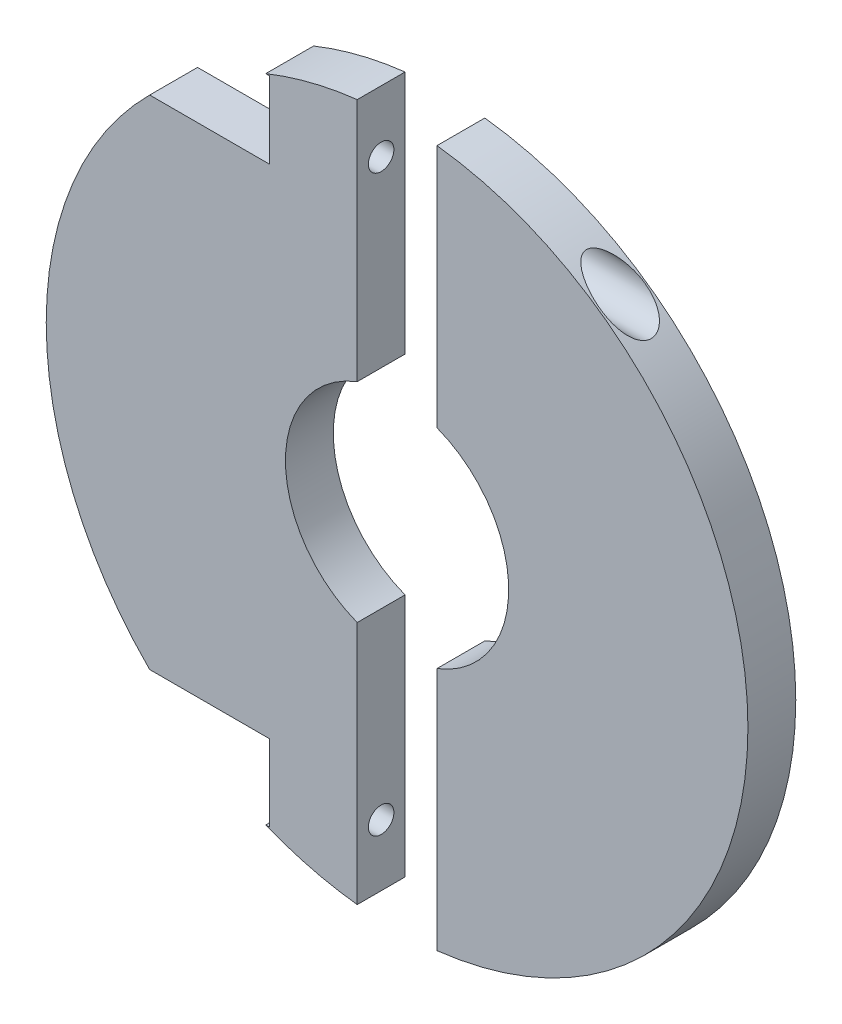
ISO-10303-21;
HEADER;
FILE_DESCRIPTION(('STEP AP214'),'2;1');
FILE_NAME('part.step','',(''),(''),'','','');
FILE_SCHEMA(('AUTOMOTIVE_DESIGN { 1 0 10303 214 1 1 1 1 }'));
ENDSEC;
DATA;
#1=APPLICATION_CONTEXT('core data for automotive mechanical design processes');
#2=APPLICATION_PROTOCOL_DEFINITION('international standard','automotive_design',2000,#1);
#3=PRODUCT_CONTEXT('',#1,'mechanical');
#4=PRODUCT('Part','Part','',(#3));
#5=PRODUCT_RELATED_PRODUCT_CATEGORY('part','',(#4));
#6=PRODUCT_DEFINITION_FORMATION('','',#4);
#7=PRODUCT_DEFINITION_CONTEXT('part definition',#1,'design');
#8=PRODUCT_DEFINITION('design','',#6,#7);
#9=PRODUCT_DEFINITION_SHAPE('','',#8);
#10=(LENGTH_UNIT() NAMED_UNIT(*) SI_UNIT(.MILLI.,.METRE.));
#11=(NAMED_UNIT(*) PLANE_ANGLE_UNIT() SI_UNIT($,.RADIAN.));
#12=(NAMED_UNIT(*) SI_UNIT($,.STERADIAN.) SOLID_ANGLE_UNIT());
#13=UNCERTAINTY_MEASURE_WITH_UNIT(LENGTH_MEASURE(1.E-05),#10,'distance_accuracy_value','');
#14=(GEOMETRIC_REPRESENTATION_CONTEXT(3) GLOBAL_UNCERTAINTY_ASSIGNED_CONTEXT((#13)) GLOBAL_UNIT_ASSIGNED_CONTEXT((#10,
#11,#12)) REPRESENTATION_CONTEXT('',''));
#15=CARTESIAN_POINT('',(0.,0.,0.));
#16=DIRECTION('',(0.,0.,1.));
#17=DIRECTION('',(1.,0.,0.));
#18=AXIS2_PLACEMENT_3D('',#15,#16,#17);
#19=CARTESIAN_POINT('',(0.,0.,7.5));
#20=DIRECTION('',(0.,0.,-1.));
#21=DIRECTION('',(-1.,0.,0.));
#22=AXIS2_PLACEMENT_3D('',#19,#20,#21);
#23=CYLINDRICAL_SURFACE('',#22,55.);
#24=CARTESIAN_POINT('',(0.,0.,0.));
#25=DIRECTION('',(0.,0.,1.));
#26=DIRECTION('',(1.,0.,0.));
#27=AXIS2_PLACEMENT_3D('',#24,#25,#26);
#28=CIRCLE('',#27,55.);
#29=CARTESIAN_POINT('',(-6.25,54.643732485986,0.));
#30=VERTEX_POINT('',#29);
#31=CARTESIAN_POINT('',(-20.591260281974,51.,0.));
#32=VERTEX_POINT('',#31);
#33=EDGE_CURVE('E210',#30,#32,#28,.T.);
#34=ORIENTED_EDGE('',*,*,#33,.T.);
#35=DIRECTION('',(0.,0.,-1.));
#36=VECTOR('',#35,1.);
#37=CARTESIAN_POINT('',(-20.591260281974,51.,7.5));
#38=LINE('',#37,#36);
#39=CARTESIAN_POINT('',(-20.591260281974,51.,7.5));
#40=VERTEX_POINT('',#39);
#41=EDGE_CURVE('E189',#32,#40,#38,.F.);
#42=ORIENTED_EDGE('',*,*,#41,.T.);
#43=CARTESIAN_POINT('',(0.,0.,7.5));
#44=DIRECTION('',(0.,0.,1.));
#45=DIRECTION('',(1.,0.,0.));
#46=AXIS2_PLACEMENT_3D('',#43,#44,#45);
#47=CIRCLE('',#46,55.);
#48=CARTESIAN_POINT('',(-6.25,54.643732485986,7.5));
#49=VERTEX_POINT('',#48);
#50=EDGE_CURVE('E220',#49,#40,#47,.T.);
#51=ORIENTED_EDGE('',*,*,#50,.F.);
#52=DIRECTION('',(0.,0.,-1.));
#53=VECTOR('',#52,1.);
#54=CARTESIAN_POINT('',(-6.25,54.643732485986,7.5));
#55=LINE('',#54,#53);
#56=EDGE_CURVE('E201',#49,#30,#55,.T.);
#57=ORIENTED_EDGE('',*,*,#56,.T.);
#58=EDGE_LOOP('',(#34,#42,#51,#57));
#59=FACE_BOUND('',#58,.T.);
#60=ADVANCED_FACE('F49',(#59),#23,.T.);
#61=CARTESIAN_POINT('',(-38.7814388593306,39.,7.5));
#62=VERTEX_POINT('',#61);
#63=CARTESIAN_POINT('',(-38.7814388593306,-39.,7.5));
#64=VERTEX_POINT('',#63);
#65=EDGE_CURVE('E222',#62,#64,#47,.T.);
#66=ORIENTED_EDGE('',*,*,#65,.F.);
#67=DIRECTION('',(0.,0.,-1.));
#68=VECTOR('',#67,1.);
#69=CARTESIAN_POINT('',(-38.7814388593306,39.,7.49999999999996));
#70=LINE('',#69,#68);
#71=CARTESIAN_POINT('',(-38.7814388593306,39.,0.));
#72=VERTEX_POINT('',#71);
#73=EDGE_CURVE('E145',#62,#72,#70,.T.);
#74=ORIENTED_EDGE('',*,*,#73,.T.);
#75=CARTESIAN_POINT('',(-38.7814388593306,-39.,0.));
#76=VERTEX_POINT('',#75);
#77=EDGE_CURVE('E225',#72,#76,#28,.T.);
#78=ORIENTED_EDGE('',*,*,#77,.T.);
#79=DIRECTION('',(0.,0.,-1.));
#80=VECTOR('',#79,1.);
#81=CARTESIAN_POINT('',(-38.7814388593306,-39.,7.49999999999996));
#82=LINE('',#81,#80);
#83=EDGE_CURVE('E184',#76,#64,#82,.F.);
#84=ORIENTED_EDGE('',*,*,#83,.T.);
#85=EDGE_LOOP('',(#66,#74,#78,#84));
#86=FACE_BOUND('',#85,.T.);
#87=ADVANCED_FACE('F247',(#86),#23,.T.);
#88=CARTESIAN_POINT('',(-20.591260281974,-51.,7.5));
#89=VERTEX_POINT('',#88);
#90=CARTESIAN_POINT('',(-6.25,-54.643732485986,7.5));
#91=VERTEX_POINT('',#90);
#92=EDGE_CURVE('E209',#89,#91,#47,.T.);
#93=ORIENTED_EDGE('',*,*,#92,.F.);
#94=DIRECTION('',(0.,0.,-1.));
#95=VECTOR('',#94,1.);
#96=CARTESIAN_POINT('',(-20.591260281974,-51.,7.5));
#97=LINE('',#96,#95);
#98=CARTESIAN_POINT('',(-20.591260281974,-51.,0.));
#99=VERTEX_POINT('',#98);
#100=EDGE_CURVE('E181',#89,#99,#97,.T.);
#101=ORIENTED_EDGE('',*,*,#100,.T.);
#102=CARTESIAN_POINT('',(-6.25,-54.643732485986,0.));
#103=VERTEX_POINT('',#102);
#104=EDGE_CURVE('E204',#99,#103,#28,.T.);
#105=ORIENTED_EDGE('',*,*,#104,.T.);
#106=DIRECTION('',(0.,0.,-1.));
#107=VECTOR('',#106,1.);
#108=CARTESIAN_POINT('',(-6.25,-54.643732485986,7.5));
#109=LINE('',#108,#107);
#110=EDGE_CURVE('E206',#103,#91,#109,.F.);
#111=ORIENTED_EDGE('',*,*,#110,.T.);
#112=EDGE_LOOP('',(#93,#101,#105,#111));
#113=FACE_BOUND('',#112,.T.);
#114=ADVANCED_FACE('F51',(#113),#23,.T.);
#115=CARTESIAN_POINT('',(0.,0.,7.5));
#116=DIRECTION('',(0.,0.,1.));
#117=DIRECTION('',(1.,0.,0.));
#118=AXIS2_PLACEMENT_3D('',#115,#116,#117);
#119=PLANE('',#118);
#120=DIRECTION('',(1.,0.,0.));
#121=VECTOR('',#120,1.);
#122=CARTESIAN_POINT('',(-40.,51.,7.5));
#123=LINE('',#122,#121);
#124=CARTESIAN_POINT('',(-20.,51.,7.5));
#125=VERTEX_POINT('',#124);
#126=EDGE_CURVE('E150',#40,#125,#123,.T.);
#127=ORIENTED_EDGE('',*,*,#126,.T.);
#128=DIRECTION('',(0.,-1.,0.));
#129=VECTOR('',#128,1.);
#130=CARTESIAN_POINT('',(-20.,39.,7.5));
#131=LINE('',#130,#129);
#132=CARTESIAN_POINT('',(-20.,39.,7.5));
#133=VERTEX_POINT('',#132);
#134=EDGE_CURVE('E154',#125,#133,#131,.T.);
#135=ORIENTED_EDGE('',*,*,#134,.T.);
#136=DIRECTION('',(1.,0.,0.));
#137=VECTOR('',#136,1.);
#138=CARTESIAN_POINT('',(-40.,39.,7.5));
#139=LINE('',#138,#137);
#140=EDGE_CURVE('E139',#62,#133,#139,.T.);
#141=ORIENTED_EDGE('',*,*,#140,.F.);
#142=ORIENTED_EDGE('',*,*,#65,.T.);
#143=DIRECTION('',(1.,0.,0.));
#144=VECTOR('',#143,1.);
#145=CARTESIAN_POINT('',(-40.,-39.,7.5));
#146=LINE('',#145,#144);
#147=CARTESIAN_POINT('',(-20.,-39.,7.5));
#148=VERTEX_POINT('',#147);
#149=EDGE_CURVE('E163',#64,#148,#146,.T.);
#150=ORIENTED_EDGE('',*,*,#149,.T.);
#151=DIRECTION('',(0.,-1.,0.));
#152=VECTOR('',#151,1.);
#153=CARTESIAN_POINT('',(-20.,-39.,7.5));
#154=LINE('',#153,#152);
#155=CARTESIAN_POINT('',(-20.,-51.,7.5));
#156=VERTEX_POINT('',#155);
#157=EDGE_CURVE('E171',#148,#156,#154,.T.);
#158=ORIENTED_EDGE('',*,*,#157,.T.);
#159=DIRECTION('',(1.,0.,0.));
#160=VECTOR('',#159,1.);
#161=CARTESIAN_POINT('',(-40.,-51.,7.5));
#162=LINE('',#161,#160);
#163=EDGE_CURVE('E161',#89,#156,#162,.T.);
#164=ORIENTED_EDGE('',*,*,#163,.F.);
#165=ORIENTED_EDGE('',*,*,#92,.T.);
#166=DIRECTION('',(0.,-1.,0.));
#167=VECTOR('',#166,1.);
#168=CARTESIAN_POINT('',(-6.25,-61.0752829571837,7.5));
#169=LINE('',#168,#167);
#170=CARTESIAN_POINT('',(-6.25,-16.3458710382775,7.5));
#171=VERTEX_POINT('',#170);
#172=EDGE_CURVE('E211',#171,#91,#169,.T.);
#173=ORIENTED_EDGE('',*,*,#172,.F.);
#174=CARTESIAN_POINT('',(0.,0.,7.5));
#175=DIRECTION('',(0.,0.,1.));
#176=DIRECTION('',(1.,0.,0.));
#177=AXIS2_PLACEMENT_3D('',#174,#175,#176);
#178=CIRCLE('',#177,17.5);
#179=CARTESIAN_POINT('',(-6.25,16.3458710382775,7.5));
#180=VERTEX_POINT('',#179);
#181=EDGE_CURVE('E197',#180,#171,#178,.T.);
#182=ORIENTED_EDGE('',*,*,#181,.F.);
#183=EDGE_CURVE('E200',#49,#180,#169,.T.);
#184=ORIENTED_EDGE('',*,*,#183,.F.);
#185=ORIENTED_EDGE('',*,*,#50,.T.);
#186=EDGE_LOOP('',(#127,#135,#141,#142,#150,#158,#164,#165,#173,#182,#184,#185));
#187=FACE_BOUND('',#186,.T.);
#188=ADVANCED_FACE('F159',(#187),#119,.T.);
#189=CARTESIAN_POINT('',(0.,0.,0.));
#190=DIRECTION('',(0.,0.,1.));
#191=DIRECTION('',(1.,0.,0.));
#192=AXIS2_PLACEMENT_3D('',#189,#190,#191);
#193=PLANE('',#192);
#194=DIRECTION('',(0.,1.,0.));
#195=VECTOR('',#194,1.);
#196=CARTESIAN_POINT('',(-20.,39.,0.));
#197=LINE('',#196,#195);
#198=CARTESIAN_POINT('',(-20.,39.,0.));
#199=VERTEX_POINT('',#198);
#200=CARTESIAN_POINT('',(-20.,51.,0.));
#201=VERTEX_POINT('',#200);
#202=EDGE_CURVE('E156',#199,#201,#197,.T.);
#203=ORIENTED_EDGE('',*,*,#202,.T.);
#204=DIRECTION('',(-1.,0.,0.));
#205=VECTOR('',#204,1.);
#206=CARTESIAN_POINT('',(0.,51.,0.));
#207=LINE('',#206,#205);
#208=EDGE_CURVE('E12',#201,#32,#207,.T.);
#209=ORIENTED_EDGE('',*,*,#208,.T.);
#210=ORIENTED_EDGE('',*,*,#33,.F.);
#211=DIRECTION('',(0.,-1.,0.));
#212=VECTOR('',#211,1.);
#213=CARTESIAN_POINT('',(-6.25,-61.0752829571837,0.));
#214=LINE('',#213,#212);
#215=CARTESIAN_POINT('',(-6.25,16.3458710382775,0.));
#216=VERTEX_POINT('',#215);
#217=EDGE_CURVE('E219',#30,#216,#214,.T.);
#218=ORIENTED_EDGE('',*,*,#217,.T.);
#219=CARTESIAN_POINT('',(0.,0.,0.));
#220=DIRECTION('',(0.,0.,1.));
#221=DIRECTION('',(1.,0.,0.));
#222=AXIS2_PLACEMENT_3D('',#219,#220,#221);
#223=CIRCLE('',#222,17.5);
#224=CARTESIAN_POINT('',(-6.25,-16.3458710382775,0.));
#225=VERTEX_POINT('',#224);
#226=EDGE_CURVE('E218',#216,#225,#223,.T.);
#227=ORIENTED_EDGE('',*,*,#226,.T.);
#228=EDGE_CURVE('E215',#225,#103,#214,.T.);
#229=ORIENTED_EDGE('',*,*,#228,.T.);
#230=ORIENTED_EDGE('',*,*,#104,.F.);
#231=DIRECTION('',(1.,0.,0.));
#232=VECTOR('',#231,1.);
#233=CARTESIAN_POINT('',(0.,-51.,0.));
#234=LINE('',#233,#232);
#235=CARTESIAN_POINT('',(-20.,-51.,0.));
#236=VERTEX_POINT('',#235);
#237=EDGE_CURVE('E214',#99,#236,#234,.T.);
#238=ORIENTED_EDGE('',*,*,#237,.T.);
#239=DIRECTION('',(0.,1.,0.));
#240=VECTOR('',#239,1.);
#241=CARTESIAN_POINT('',(-20.,-39.,0.));
#242=LINE('',#241,#240);
#243=CARTESIAN_POINT('',(-20.,-39.,0.));
#244=VERTEX_POINT('',#243);
#245=EDGE_CURVE('E176',#236,#244,#242,.T.);
#246=ORIENTED_EDGE('',*,*,#245,.T.);
#247=DIRECTION('',(-1.,0.,0.));
#248=VECTOR('',#247,1.);
#249=CARTESIAN_POINT('',(0.,-39.,0.));
#250=LINE('',#249,#248);
#251=EDGE_CURVE('E240',#244,#76,#250,.T.);
#252=ORIENTED_EDGE('',*,*,#251,.T.);
#253=ORIENTED_EDGE('',*,*,#77,.F.);
#254=DIRECTION('',(1.,0.,0.));
#255=VECTOR('',#254,1.);
#256=CARTESIAN_POINT('',(0.,39.,0.));
#257=LINE('',#256,#255);
#258=EDGE_CURVE('E57',#72,#199,#257,.T.);
#259=ORIENTED_EDGE('',*,*,#258,.T.);
#260=EDGE_LOOP('',(#203,#209,#210,#218,#227,#229,#230,#238,#246,#252,#253,#259));
#261=FACE_BOUND('',#260,.T.);
#262=ADVANCED_FACE('F244',(#261),#193,.F.);
#263=CARTESIAN_POINT('',(0.,0.,0.));
#264=DIRECTION('',(0.,0.,1.));
#265=DIRECTION('',(1.,0.,0.));
#266=AXIS2_PLACEMENT_3D('',#263,#264,#265);
#267=CYLINDRICAL_SURFACE('',#266,17.5);
#268=ORIENTED_EDGE('',*,*,#181,.T.);
#269=DIRECTION('',(0.,0.,1.));
#270=VECTOR('',#269,1.);
#271=CARTESIAN_POINT('',(-6.25,-16.3458710382775,0.));
#272=LINE('',#271,#270);
#273=EDGE_CURVE('E193',#171,#225,#272,.F.);
#274=ORIENTED_EDGE('',*,*,#273,.T.);
#275=ORIENTED_EDGE('',*,*,#226,.F.);
#276=DIRECTION('',(0.,0.,1.));
#277=VECTOR('',#276,1.);
#278=CARTESIAN_POINT('',(-6.25,16.3458710382775,0.));
#279=LINE('',#278,#277);
#280=EDGE_CURVE('E196',#216,#180,#279,.T.);
#281=ORIENTED_EDGE('',*,*,#280,.T.);
#282=EDGE_LOOP('',(#268,#274,#275,#281));
#283=FACE_BOUND('',#282,.T.);
#284=ADVANCED_FACE('F260',(#283),#267,.F.);
#285=CARTESIAN_POINT('',(-6.25,-61.0752829571837,0.));
#286=DIRECTION('',(-1.,0.,0.));
#287=DIRECTION('',(0.,0.,1.));
#288=AXIS2_PLACEMENT_3D('',#285,#286,#287);
#289=PLANE('',#288);
#290=CARTESIAN_POINT('',(-6.25,45.,3.75));
#291=DIRECTION('',(-1.,0.,0.));
#292=DIRECTION('',(0.,0.,1.));
#293=AXIS2_PLACEMENT_3D('',#290,#291,#292);
#294=CIRCLE('',#293,2.);
#295=CARTESIAN_POINT('',(-6.25,45.,5.75000000000001));
#296=VERTEX_POINT('',#295);
#297=EDGE_CURVE('E205',#296,#296,#294,.T.);
#298=ORIENTED_EDGE('',*,*,#297,.T.);
#299=EDGE_LOOP('',(#298));
#300=FACE_BOUND('',#299,.T.);
#301=ORIENTED_EDGE('',*,*,#183,.T.);
#302=ORIENTED_EDGE('',*,*,#280,.F.);
#303=ORIENTED_EDGE('',*,*,#217,.F.);
#304=ORIENTED_EDGE('',*,*,#56,.F.);
#305=EDGE_LOOP('',(#301,#302,#303,#304));
#306=FACE_BOUND('',#305,.T.);
#307=ADVANCED_FACE('F268',(#300,#306),#289,.F.);
#308=CARTESIAN_POINT('',(-6.25,-45.,3.75));
#309=DIRECTION('',(-1.,0.,0.));
#310=DIRECTION('',(0.,0.,1.));
#311=AXIS2_PLACEMENT_3D('',#308,#309,#310);
#312=CIRCLE('',#311,2.);
#313=CARTESIAN_POINT('',(-6.25,-45.,5.75000000000001));
#314=VERTEX_POINT('',#313);
#315=EDGE_CURVE('E192',#314,#314,#312,.T.);
#316=ORIENTED_EDGE('',*,*,#315,.T.);
#317=EDGE_LOOP('',(#316));
#318=FACE_BOUND('',#317,.T.);
#319=ORIENTED_EDGE('',*,*,#228,.F.);
#320=ORIENTED_EDGE('',*,*,#273,.F.);
#321=ORIENTED_EDGE('',*,*,#172,.T.);
#322=ORIENTED_EDGE('',*,*,#110,.F.);
#323=EDGE_LOOP('',(#319,#320,#321,#322));
#324=FACE_BOUND('',#323,.T.);
#325=ADVANCED_FACE('F255',(#318,#324),#289,.F.);
#326=CARTESIAN_POINT('',(-55.,-45.,3.75));
#327=DIRECTION('',(1.,0.,0.));
#328=DIRECTION('',(0.,0.,-1.));
#329=AXIS2_PLACEMENT_3D('',#326,#327,#328);
#330=CYLINDRICAL_SURFACE('',#329,2.);
#331=CARTESIAN_POINT('',(-20.,-45.,3.75));
#332=DIRECTION('',(1.,0.,0.));
#333=DIRECTION('',(0.,0.,-1.));
#334=AXIS2_PLACEMENT_3D('',#331,#332,#333);
#335=CIRCLE('',#334,2.);
#336=CARTESIAN_POINT('',(-20.,-45.,1.75));
#337=VERTEX_POINT('',#336);
#338=EDGE_CURVE('E185',#337,#337,#335,.F.);
#339=ORIENTED_EDGE('',*,*,#338,.T.);
#340=EDGE_LOOP('',(#339));
#341=FACE_BOUND('',#340,.T.);
#342=ORIENTED_EDGE('',*,*,#315,.F.);
#343=EDGE_LOOP('',(#342));
#344=FACE_BOUND('',#343,.T.);
#345=ADVANCED_FACE('F276',(#341,#344),#330,.F.);
#346=CARTESIAN_POINT('',(-55.,45.,3.75));
#347=DIRECTION('',(1.,0.,0.));
#348=DIRECTION('',(0.,0.,-1.));
#349=AXIS2_PLACEMENT_3D('',#346,#347,#348);
#350=CYLINDRICAL_SURFACE('',#349,2.);
#351=CARTESIAN_POINT('',(-20.,45.,3.75));
#352=DIRECTION('',(1.,0.,0.));
#353=DIRECTION('',(0.,0.,-1.));
#354=AXIS2_PLACEMENT_3D('',#351,#352,#353);
#355=CIRCLE('',#354,2.);
#356=CARTESIAN_POINT('',(-20.,45.,1.75));
#357=VERTEX_POINT('',#356);
#358=EDGE_CURVE('E168',#357,#357,#355,.F.);
#359=ORIENTED_EDGE('',*,*,#358,.T.);
#360=EDGE_LOOP('',(#359));
#361=FACE_BOUND('',#360,.T.);
#362=ORIENTED_EDGE('',*,*,#297,.F.);
#363=EDGE_LOOP('',(#362));
#364=FACE_BOUND('',#363,.T.);
#365=ADVANCED_FACE('F337',(#361,#364),#350,.F.);
#366=CARTESIAN_POINT('',(-40.,51.,0.));
#367=DIRECTION('',(0.,1.,0.));
#368=DIRECTION('',(0.,0.,1.));
#369=AXIS2_PLACEMENT_3D('',#366,#367,#368);
#370=PLANE('',#369);
#371=ORIENTED_EDGE('',*,*,#208,.F.);
#372=DIRECTION('',(0.,0.,1.));
#373=VECTOR('',#372,1.);
#374=CARTESIAN_POINT('',(-20.,51.,0.));
#375=LINE('',#374,#373);
#376=EDGE_CURVE('E64',#201,#125,#375,.T.);
#377=ORIENTED_EDGE('',*,*,#376,.T.);
#378=ORIENTED_EDGE('',*,*,#126,.F.);
#379=ORIENTED_EDGE('',*,*,#41,.F.);
#380=EDGE_LOOP('',(#371,#377,#378,#379));
#381=FACE_BOUND('',#380,.T.);
#382=ADVANCED_FACE('F267',(#381),#370,.F.);
#383=CARTESIAN_POINT('',(-40.,39.,0.));
#384=DIRECTION('',(0.,-1.,0.));
#385=DIRECTION('',(0.,0.,-1.));
#386=AXIS2_PLACEMENT_3D('',#383,#384,#385);
#387=PLANE('',#386);
#388=ORIENTED_EDGE('',*,*,#140,.T.);
#389=DIRECTION('',(0.,0.,-1.));
#390=VECTOR('',#389,1.);
#391=CARTESIAN_POINT('',(-20.,39.,0.));
#392=LINE('',#391,#390);
#393=EDGE_CURVE('E142',#133,#199,#392,.T.);
#394=ORIENTED_EDGE('',*,*,#393,.T.);
#395=ORIENTED_EDGE('',*,*,#258,.F.);
#396=ORIENTED_EDGE('',*,*,#73,.F.);
#397=EDGE_LOOP('',(#388,#394,#395,#396));
#398=FACE_BOUND('',#397,.T.);
#399=ADVANCED_FACE('F141',(#398),#387,.F.);
#400=CARTESIAN_POINT('',(-20.,0.,0.));
#401=DIRECTION('',(1.,0.,0.));
#402=DIRECTION('',(0.,0.,-1.));
#403=AXIS2_PLACEMENT_3D('',#400,#401,#402);
#404=PLANE('',#403);
#405=ORIENTED_EDGE('',*,*,#134,.F.);
#406=ORIENTED_EDGE('',*,*,#376,.F.);
#407=ORIENTED_EDGE('',*,*,#202,.F.);
#408=ORIENTED_EDGE('',*,*,#393,.F.);
#409=EDGE_LOOP('',(#405,#406,#407,#408));
#410=FACE_BOUND('',#409,.T.);
#411=ORIENTED_EDGE('',*,*,#358,.F.);
#412=EDGE_LOOP('',(#411));
#413=FACE_BOUND('',#412,.T.);
#414=ADVANCED_FACE('F152',(#410,#413),#404,.F.);
#415=CARTESIAN_POINT('',(-40.,-39.,0.));
#416=DIRECTION('',(0.,1.,0.));
#417=DIRECTION('',(0.,0.,1.));
#418=AXIS2_PLACEMENT_3D('',#415,#416,#417);
#419=PLANE('',#418);
#420=ORIENTED_EDGE('',*,*,#251,.F.);
#421=DIRECTION('',(0.,0.,1.));
#422=VECTOR('',#421,1.);
#423=CARTESIAN_POINT('',(-20.,-39.,0.));
#424=LINE('',#423,#422);
#425=EDGE_CURVE('E72',#244,#148,#424,.T.);
#426=ORIENTED_EDGE('',*,*,#425,.T.);
#427=ORIENTED_EDGE('',*,*,#149,.F.);
#428=ORIENTED_EDGE('',*,*,#83,.F.);
#429=EDGE_LOOP('',(#420,#426,#427,#428));
#430=FACE_BOUND('',#429,.T.);
#431=ADVANCED_FACE('F366',(#430),#419,.F.);
#432=CARTESIAN_POINT('',(-40.,-51.,0.));
#433=DIRECTION('',(0.,-1.,0.));
#434=DIRECTION('',(0.,0.,-1.));
#435=AXIS2_PLACEMENT_3D('',#432,#433,#434);
#436=PLANE('',#435);
#437=ORIENTED_EDGE('',*,*,#163,.T.);
#438=DIRECTION('',(0.,0.,-1.));
#439=VECTOR('',#438,1.);
#440=CARTESIAN_POINT('',(-20.,-51.,0.));
#441=LINE('',#440,#439);
#442=EDGE_CURVE('E174',#156,#236,#441,.T.);
#443=ORIENTED_EDGE('',*,*,#442,.T.);
#444=ORIENTED_EDGE('',*,*,#237,.F.);
#445=ORIENTED_EDGE('',*,*,#100,.F.);
#446=EDGE_LOOP('',(#437,#443,#444,#445));
#447=FACE_BOUND('',#446,.T.);
#448=ADVANCED_FACE('F373',(#447),#436,.F.);
#449=CARTESIAN_POINT('',(-20.,0.,0.));
#450=DIRECTION('',(1.,0.,0.));
#451=DIRECTION('',(0.,0.,-1.));
#452=AXIS2_PLACEMENT_3D('',#449,#450,#451);
#453=PLANE('',#452);
#454=ORIENTED_EDGE('',*,*,#425,.F.);
#455=ORIENTED_EDGE('',*,*,#245,.F.);
#456=ORIENTED_EDGE('',*,*,#442,.F.);
#457=ORIENTED_EDGE('',*,*,#157,.F.);
#458=EDGE_LOOP('',(#454,#455,#456,#457));
#459=FACE_BOUND('',#458,.T.);
#460=ORIENTED_EDGE('',*,*,#338,.F.);
#461=EDGE_LOOP('',(#460));
#462=FACE_BOUND('',#461,.T.);
#463=ADVANCED_FACE('F381',(#459,#462),#453,.F.);
#464=CLOSED_SHELL('',(#60,#87,#114,#188,#262,#284,#307,#325,#345,#365,#382,#399,#414,#431,#448,#463));
#465=MANIFOLD_SOLID_BREP('B2',#464);
#466=CARTESIAN_POINT('',(-55.,45.,3.75));
#467=DIRECTION('',(1.,0.,0.));
#468=DIRECTION('',(0.,0.,-1.));
#469=AXIS2_PLACEMENT_3D('',#466,#467,#468);
#470=CYLINDRICAL_SURFACE('',#469,2.);
#471=CARTESIAN_POINT('',(6.25,45.,3.75));
#472=DIRECTION('',(1.,0.,0.));
#473=DIRECTION('',(0.,0.,-1.));
#474=AXIS2_PLACEMENT_3D('',#471,#472,#473);
#475=CIRCLE('',#474,2.);
#476=CARTESIAN_POINT('',(6.25,45.,1.75));
#477=VERTEX_POINT('',#476);
#478=EDGE_CURVE('E494',#477,#477,#475,.T.);
#479=ORIENTED_EDGE('',*,*,#478,.F.);
#480=EDGE_LOOP('',(#479));
#481=FACE_BOUND('',#480,.T.);
#482=CARTESIAN_POINT('',(20.,45.,3.75));
#483=DIRECTION('',(1.,0.,0.));
#484=DIRECTION('',(0.,0.,-1.));
#485=AXIS2_PLACEMENT_3D('',#482,#483,#484);
#486=CIRCLE('',#485,2.);
#487=CARTESIAN_POINT('',(20.,45.,1.75));
#488=VERTEX_POINT('',#487);
#489=EDGE_CURVE('E506',#488,#488,#486,.F.);
#490=ORIENTED_EDGE('',*,*,#489,.F.);
#491=EDGE_LOOP('',(#490));
#492=FACE_BOUND('',#491,.T.);
#493=ADVANCED_FACE('F414',(#481,#492),#470,.F.);
#494=CARTESIAN_POINT('',(0.,0.,0.));
#495=DIRECTION('',(0.,0.,1.));
#496=DIRECTION('',(1.,0.,0.));
#497=AXIS2_PLACEMENT_3D('',#494,#495,#496);
#498=CYLINDRICAL_SURFACE('',#497,17.5);
#499=CARTESIAN_POINT('',(0.,0.,7.5));
#500=DIRECTION('',(0.,0.,1.));
#501=DIRECTION('',(1.,0.,0.));
#502=AXIS2_PLACEMENT_3D('',#499,#500,#501);
#503=CIRCLE('',#502,17.5);
#504=CARTESIAN_POINT('',(6.25,-16.3458710382775,7.5));
#505=VERTEX_POINT('',#504);
#506=CARTESIAN_POINT('',(6.25,16.3458710382775,7.5));
#507=VERTEX_POINT('',#506);
#508=EDGE_CURVE('E469',#505,#507,#503,.T.);
#509=ORIENTED_EDGE('',*,*,#508,.T.);
#510=DIRECTION('',(0.,0.,1.));
#511=VECTOR('',#510,1.);
#512=CARTESIAN_POINT('',(6.25,16.3458710382775,0.));
#513=LINE('',#512,#511);
#514=CARTESIAN_POINT('',(6.25,16.3458710382775,0.));
#515=VERTEX_POINT('',#514);
#516=EDGE_CURVE('E47',#507,#515,#513,.F.);
#517=ORIENTED_EDGE('',*,*,#516,.T.);
#518=CARTESIAN_POINT('',(0.,0.,0.));
#519=DIRECTION('',(0.,0.,1.));
#520=DIRECTION('',(1.,0.,0.));
#521=AXIS2_PLACEMENT_3D('',#518,#519,#520);
#522=CIRCLE('',#521,17.5);
#523=CARTESIAN_POINT('',(6.25,-16.3458710382775,0.));
#524=VERTEX_POINT('',#523);
#525=EDGE_CURVE('E489',#524,#515,#522,.T.);
#526=ORIENTED_EDGE('',*,*,#525,.F.);
#527=DIRECTION('',(0.,0.,1.));
#528=VECTOR('',#527,1.);
#529=CARTESIAN_POINT('',(6.25,-16.3458710382775,0.));
#530=LINE('',#529,#528);
#531=EDGE_CURVE('E429',#524,#505,#530,.T.);
#532=ORIENTED_EDGE('',*,*,#531,.T.);
#533=EDGE_LOOP('',(#509,#517,#526,#532));
#534=FACE_BOUND('',#533,.T.);
#535=ADVANCED_FACE('F527',(#534),#498,.F.);
#536=CARTESIAN_POINT('',(0.,0.,0.));
#537=DIRECTION('',(0.,0.,1.));
#538=DIRECTION('',(1.,0.,0.));
#539=AXIS2_PLACEMENT_3D('',#536,#537,#538);
#540=PLANE('',#539);
#541=CARTESIAN_POINT('',(0.,0.,0.));
#542=DIRECTION('',(0.,0.,1.));
#543=DIRECTION('',(1.,0.,0.));
#544=AXIS2_PLACEMENT_3D('',#541,#542,#543);
#545=CIRCLE('',#544,55.);
#546=CARTESIAN_POINT('',(6.25,-54.643732485986,0.));
#547=VERTEX_POINT('',#546);
#548=CARTESIAN_POINT('',(6.25,54.643732485986,0.));
#549=VERTEX_POINT('',#548);
#550=EDGE_CURVE('E484',#547,#549,#545,.T.);
#551=ORIENTED_EDGE('',*,*,#550,.F.);
#552=DIRECTION('',(0.,1.,0.));
#553=VECTOR('',#552,1.);
#554=CARTESIAN_POINT('',(6.25,-61.0752829571837,0.));
#555=LINE('',#554,#553);
#556=EDGE_CURVE('E463',#547,#524,#555,.T.);
#557=ORIENTED_EDGE('',*,*,#556,.T.);
#558=ORIENTED_EDGE('',*,*,#525,.T.);
#559=EDGE_CURVE('E445',#515,#549,#555,.T.);
#560=ORIENTED_EDGE('',*,*,#559,.T.);
#561=EDGE_LOOP('',(#551,#557,#558,#560));
#562=FACE_BOUND('',#561,.T.);
#563=ADVANCED_FACE('F538',(#562),#540,.F.);
#564=CARTESIAN_POINT('',(0.,0.,7.5));
#565=DIRECTION('',(0.,0.,1.));
#566=DIRECTION('',(1.,0.,0.));
#567=AXIS2_PLACEMENT_3D('',#564,#565,#566);
#568=PLANE('',#567);
#569=DIRECTION('',(0.,1.,0.));
#570=VECTOR('',#569,1.);
#571=CARTESIAN_POINT('',(6.25,-61.0752829571837,7.5));
#572=LINE('',#571,#570);
#573=CARTESIAN_POINT('',(6.25,-54.643732485986,7.5));
#574=VERTEX_POINT('',#573);
#575=EDGE_CURVE('E437',#574,#505,#572,.T.);
#576=ORIENTED_EDGE('',*,*,#575,.F.);
#577=CARTESIAN_POINT('',(0.,0.,7.5));
#578=DIRECTION('',(0.,0.,1.));
#579=DIRECTION('',(1.,0.,0.));
#580=AXIS2_PLACEMENT_3D('',#577,#578,#579);
#581=CIRCLE('',#580,55.);
#582=CARTESIAN_POINT('',(6.25,54.643732485986,7.5));
#583=VERTEX_POINT('',#582);
#584=EDGE_CURVE('E477',#574,#583,#581,.T.);
#585=ORIENTED_EDGE('',*,*,#584,.T.);
#586=EDGE_CURVE('E480',#507,#583,#572,.T.);
#587=ORIENTED_EDGE('',*,*,#586,.F.);
#588=ORIENTED_EDGE('',*,*,#508,.F.);
#589=EDGE_LOOP('',(#576,#585,#587,#588));
#590=FACE_BOUND('',#589,.T.);
#591=ADVANCED_FACE('F475',(#590),#568,.T.);
#592=CARTESIAN_POINT('',(0.,0.,7.5));
#593=DIRECTION('',(0.,0.,-1.));
#594=DIRECTION('',(-1.,0.,0.));
#595=AXIS2_PLACEMENT_3D('',#592,#593,#594);
#596=CYLINDRICAL_SURFACE('',#595,55.);
#597=CARTESIAN_POINT('',(31.6227766016838,45.,0.250000000000001));
#598=CARTESIAN_POINT('',(31.8420950543226,44.8458787635018,0.250000458388072));
#599=CARTESIAN_POINT('',(32.0602923742594,44.6901454623172,0.260154015410824));
#600=CARTESIAN_POINT('',(32.49313519459,44.3764306989816,0.302359411949685));
#601=CARTESIAN_POINT('',(32.7077791959112,44.2184483377699,0.334420264122423));
#602=CARTESIAN_POINT('',(33.1306135743933,43.9025255510696,0.422489837433311));
#603=CARTESIAN_POINT('',(33.3388295652085,43.7445884258366,0.478385169017945));
#604=CARTESIAN_POINT('',(33.7471850259007,43.4303314002269,0.617013201334181));
#605=CARTESIAN_POINT('',(33.947334463536,43.2740096932389,0.699711562534951));
#606=CARTESIAN_POINT('',(34.312092274444,42.985201925741,0.883616021373642));
#607=CARTESIAN_POINT('',(34.4780338800831,42.8521599899524,0.981265691483649));
#608=CARTESIAN_POINT('',(34.7974800886019,42.5931626701778,1.20319911924517));
#609=CARTESIAN_POINT('',(34.950989528796,42.4672045357942,1.32747244843959));
#610=CARTESIAN_POINT('',(35.2180307423911,42.2458958671199,1.58455735170681));
#611=CARTESIAN_POINT('',(35.3340923011092,42.1488032727651,1.71319894691111));
#612=CARTESIAN_POINT('',(35.5482834516401,41.968310371704,1.99316842235639));
#613=CARTESIAN_POINT('',(35.6464440688622,41.884886400912,2.14445620775796));
#614=CARTESIAN_POINT('',(35.79617414905,41.7569279115682,2.42713568390587));
#615=CARTESIAN_POINT('',(35.8532296428878,41.7079134834359,2.55358276542928));
#616=CARTESIAN_POINT('',(35.9508780740192,41.6237738565797,2.81719051708628));
#617=CARTESIAN_POINT('',(35.9914831294569,41.5886384344246,2.9543432118212));
#618=CARTESIAN_POINT('',(36.0380297059552,41.5482951177347,3.16605757901066));
#619=CARTESIAN_POINT('',(36.0511767659733,41.5368853619645,3.23794779026547));
#620=CARTESIAN_POINT('',(36.0723199098445,41.5185252218983,3.38303124682096));
#621=CARTESIAN_POINT('',(36.0803184211647,41.5115727360693,3.45622386130426));
#622=CARTESIAN_POINT('',(36.090983451059,41.5023007193234,3.60328107292141));
#623=CARTESIAN_POINT('',(36.093650692213,41.4999805605585,3.67714557762638));
#624=CARTESIAN_POINT('',(36.0936054742506,41.5000197235499,3.82484833082712));
#625=CARTESIAN_POINT('',(36.0908934914742,41.5023786309664,3.89868658106867));
#626=CARTESIAN_POINT('',(36.0759487048528,41.5153722306184,4.1027135981675));
#627=CARTESIAN_POINT('',(36.0579670234048,41.5310030779537,4.23223446405736));
#628=CARTESIAN_POINT('',(36.006368167402,41.5757451049547,4.48558301240364));
#629=CARTESIAN_POINT('',(35.9727483423371,41.6048585697865,4.60940972584677));
#630=CARTESIAN_POINT('',(35.8902801639032,41.6760224068813,4.85361411064645));
#631=CARTESIAN_POINT('',(35.8408950494652,41.718527946866,4.97367514788929));
#632=CARTESIAN_POINT('',(35.7298394524554,41.8136811875366,5.20357742760476));
#633=CARTESIAN_POINT('',(35.6681628606923,41.866333931222,5.31341354803375));
#634=CARTESIAN_POINT('',(35.494938914923,42.0134345110411,5.58479255165745));
#635=CARTESIAN_POINT('',(35.3756092819021,42.1140605942878,5.73802948557669));
#636=CARTESIAN_POINT('',(35.1188488477503,42.328413158819,6.01801360071261));
#637=CARTESIAN_POINT('',(34.9813694214777,42.4421747249411,6.14468716888734));
#638=CARTESIAN_POINT('',(34.7284623367669,42.6491955934893,6.34599842538182));
#639=CARTESIAN_POINT('',(34.6157057348918,42.7407880977771,6.42581931282805));
#640=CARTESIAN_POINT('',(34.3844337180939,42.9270632553372,6.5725884667519));
#641=CARTESIAN_POINT('',(34.265915364424,43.0217474772643,6.6395300760835));
#642=CARTESIAN_POINT('',(34.0243103134206,43.2130777206263,6.76161038302518));
#643=CARTESIAN_POINT('',(33.9012194157791,43.3097255069179,6.81673789713291));
#644=CARTESIAN_POINT('',(33.6514801057161,43.5040567363227,6.91607979672159));
#645=CARTESIAN_POINT('',(33.5248305826258,43.6017404967124,6.96029073196981));
#646=CARTESIAN_POINT('',(33.1991439076037,43.8506398383589,7.0599033233812));
#647=CARTESIAN_POINT('',(32.9981554040149,44.0021110395841,7.10833884520236));
#648=CARTESIAN_POINT('',(32.5914893897334,44.3041656112893,7.18366389445192));
#649=CARTESIAN_POINT('',(32.3858093650551,44.4547484486263,7.21054157708577));
#650=CARTESIAN_POINT('',(31.9708632750705,44.7541002549348,7.24460613648321));
#651=CARTESIAN_POINT('',(31.7615902936654,44.9028644839525,7.25174939850707));
#652=CARTESIAN_POINT('',(31.3411712803159,45.1973102202744,7.24753378121093));
#653=CARTESIAN_POINT('',(31.1300256377677,45.3429923480787,7.23617866266074));
#654=CARTESIAN_POINT('',(30.6977862786064,45.6367954839781,7.19491469410993));
#655=CARTESIAN_POINT('',(30.4766551202353,45.784752099517,7.164229206721));
#656=CARTESIAN_POINT('',(30.0346132575873,46.0759380748463,7.08394329260879));
#657=CARTESIAN_POINT('',(29.8137026387433,46.2191660114071,7.03433722658881));
#658=CARTESIAN_POINT('',(29.3743130986205,46.4996497376504,6.91609230585669));
#659=CARTESIAN_POINT('',(29.1558283649269,46.6369247182068,6.84752084093213));
#660=CARTESIAN_POINT('',(28.7223792093079,46.9051144307061,6.69019053331859));
#661=CARTESIAN_POINT('',(28.5074124010178,47.03603360362,6.60144603979304));
#662=CARTESIAN_POINT('',(28.1190812654533,47.2690135090598,6.41827410862014));
#663=CARTESIAN_POINT('',(27.9447870085281,47.3722313158242,6.32729692016065));
#664=CARTESIAN_POINT('',(27.602386829666,47.572549890184,6.12741185435794));
#665=CARTESIAN_POINT('',(27.4342908727988,47.6696409720063,6.01847652262712));
#666=CARTESIAN_POINT('',(27.1893925242828,47.8094755457665,5.83869681068185));
#667=CARTESIAN_POINT('',(27.1085888676154,47.8553306083915,5.77569053146518));
#668=CARTESIAN_POINT('',(26.9504887759667,47.9445447793906,5.64367746535775));
#669=CARTESIAN_POINT('',(26.8731934361805,47.9879031094765,5.57466882404402));
#670=CARTESIAN_POINT('',(26.7234743194077,48.0714389950869,5.4302382114388));
#671=CARTESIAN_POINT('',(26.6510364186184,48.1116258384102,5.35483641880215));
#672=CARTESIAN_POINT('',(26.5123724890051,48.1881766190425,5.19680068394398));
#673=CARTESIAN_POINT('',(26.4461406096783,48.2245441608486,5.11417369804295));
#674=CARTESIAN_POINT('',(26.320893992748,48.2930193215028,4.93952334645453));
#675=CARTESIAN_POINT('',(26.262019130058,48.3250451477917,4.84736548875346));
#676=CARTESIAN_POINT('',(26.1558776141691,48.3825765836612,4.65458624115878));
#677=CARTESIAN_POINT('',(26.1086069975447,48.4080844195809,4.55396775679646));
#678=CARTESIAN_POINT('',(26.0289326095628,48.4509727958841,4.34364992361395));
#679=CARTESIAN_POINT('',(25.9967256290411,48.4682458101415,4.23385133139605));
#680=CARTESIAN_POINT('',(25.9520145298561,48.4922017740142,4.00922988902914));
#681=CARTESIAN_POINT('',(25.939473247438,48.4989046988614,3.89441693816));
#682=CARTESIAN_POINT('',(25.9360712931067,48.5007235742445,3.67914917355556));
#683=CARTESIAN_POINT('',(25.9426394006944,48.4972136804968,3.57873889959587));
#684=CARTESIAN_POINT('',(25.9712640499477,48.4818904028324,3.38079257528502));
#685=CARTESIAN_POINT('',(25.9933336134412,48.4700700377875,3.28325901331193));
#686=CARTESIAN_POINT('',(26.0572635931149,48.4357366824542,3.07205382449279));
#687=CARTESIAN_POINT('',(26.1024664411487,48.4114125722642,2.95970787721405));
#688=CARTESIAN_POINT('',(26.2079888895033,48.3543678617263,2.74468209616582));
#689=CARTESIAN_POINT('',(26.2683379616683,48.3216308884435,2.64202165083824));
#690=CARTESIAN_POINT('',(26.3867489058574,48.2570522776688,2.46604136725706));
#691=CARTESIAN_POINT('',(26.4428615904977,48.2263369567011,2.39095589794038));
#692=CARTESIAN_POINT('',(26.5604916348344,48.1616526834651,2.24659962879725));
#693=CARTESIAN_POINT('',(26.622012398959,48.1276816804883,2.17733254611662));
#694=CARTESIAN_POINT('',(26.7493153352047,48.0570435928858,2.04407426242137));
#695=CARTESIAN_POINT('',(26.8151051472988,48.0203716578518,1.98009301350092));
#696=CARTESIAN_POINT('',(26.9499593302606,47.9448191236834,1.85705305311104));
#697=CARTESIAN_POINT('',(27.0190249564956,47.9059376766638,1.79799625310939));
#698=CARTESIAN_POINT('',(27.2218766519451,47.7911344946375,1.63418359106525));
#699=CARTESIAN_POINT('',(27.3589429790794,47.7128316668171,1.53514000504755));
#700=CARTESIAN_POINT('',(27.6390921553925,47.5510971388355,1.35063703762005));
#701=CARTESIAN_POINT('',(27.7821800392873,47.467661118687,1.26518932119923));
#702=CARTESIAN_POINT('',(28.0726118055665,47.2964788711152,1.10616854220793));
#703=CARTESIAN_POINT('',(28.2199613270271,47.2087268140293,1.03261214955294));
#704=CARTESIAN_POINT('',(28.5174667504237,47.0296106881911,0.896347084075411));
#705=CARTESIAN_POINT('',(28.6676234049546,46.9382456432534,0.83364136791726));
#706=CARTESIAN_POINT('',(29.0487515322497,46.703777961797,0.688152001758612));
#707=CARTESIAN_POINT('',(29.2809741610324,46.5585746735852,0.611985263555554));
#708=CARTESIAN_POINT('',(29.7475654207427,46.2618514994648,0.481362240494975));
#709=CARTESIAN_POINT('',(29.9819350626157,46.1103285044547,0.426916784380482));
#710=CARTESIAN_POINT('',(30.4514829099748,45.8015966866746,0.339247598277051));
#711=CARTESIAN_POINT('',(30.6866618125454,45.6443786891727,0.306059882084532));
#712=CARTESIAN_POINT('',(31.1559068850984,45.3253783561697,0.261439034097344));
#713=CARTESIAN_POINT('',(31.3899733617123,45.1635973752938,0.249999513427956));
#714=CARTESIAN_POINT('',(31.6227766016838,45.,0.250000000000001));
#715=B_SPLINE_CURVE_WITH_KNOTS('',3,(#597,#598,#599,#600,#601,#602,#603,#604,#605,#606,#607,
#608,#609,#610,#611,#612,#613,#614,#615,#616,#617,#618,#619,#620,#621,#622,#623,#624,#625,#626,
#627,#628,#629,#630,#631,#632,#633,#634,#635,#636,#637,#638,#639,#640,#641,#642,#643,#644,#645,
#646,#647,#648,#649,#650,#651,#652,#653,#654,#655,#656,#657,#658,#659,#660,#661,#662,#663,#664,
#665,#666,#667,#668,#669,#670,#671,#672,#673,#674,#675,#676,#677,#678,#679,#680,#681,#682,#683,
#684,#685,#686,#687,#688,#689,#690,#691,#692,#693,#694,#695,#696,#697,#698,#699,#700,#701,#702,
#703,#704,#705,#706,#707,#708,#709,#710,#711,#712,#713,#714),.UNSPECIFIED.,.T.,.F.,(4,2,2,2,2,2,
2,2,2,2,2,2,2,2,2,2,2,2,2,2,2,2,2,2,2,2,2,2,2,2,2,2,2,2,2,2,2,2,2,2,2,2,2,2,2,2,2,2,2,2,2,2,2,2,
2,2,2,2,4),(0.,0.803954098267608,1.6082391423747,2.40873985625903,3.20821901135434,
3.90876985641657,4.60904679658689,5.2028672092012,5.79564843928358,6.23541589522823,
6.67485880675994,6.89648856500003,7.11801375129009,7.33950891086768,7.56098445752609,
7.95406714888388,8.3472164881433,8.75551127547896,9.1640095045921,9.81652665891707,
10.4708288612495,10.9674355011167,11.464298145475,11.9616290742705,12.4591169860757,
13.226837354088,13.9949792519475,14.7648174554633,15.534499168362,16.337269424674,
17.1402791346419,17.9404713765297,18.7400962094146,19.4055916508741,20.0721141002677,
20.4086960667384,20.7453823917134,21.0810430035399,21.4163839309787,21.7573562294259,
22.0982119063848,22.4434040365479,22.7879430415118,23.088351602685,23.3890128210548,
23.7575293236733,24.1267685296184,24.4222839565761,24.7179867635321,25.0142341962195,
25.3105960897748,25.8687396329004,26.4273594996282,26.9867558042993,27.5463042977809,
28.3980762315215,29.2502722713531,30.1039082668061,30.9572934544782),.UNSPECIFIED.);
#716=CARTESIAN_POINT('',(31.6227766016838,45.,0.250000000000001));
#717=VERTEX_POINT('',#716);
#718=EDGE_CURVE('E419',#717,#717,#715,.T.);
#719=ORIENTED_EDGE('',*,*,#718,.T.);
#720=EDGE_LOOP('',(#719));
#721=FACE_BOUND('',#720,.T.);
#722=CARTESIAN_POINT('',(31.6227766016838,-45.,0.250000000000001));
#723=CARTESIAN_POINT('',(31.3799427304015,-45.1706451879615,0.249995829388893));
#724=CARTESIAN_POINT('',(31.1356700367032,-45.3393596700522,0.262445829503002));
#725=CARTESIAN_POINT('',(30.6458841348383,-45.6718460372572,0.310977595876841));
#726=CARTESIAN_POINT('',(30.4003700556027,-45.8356136427537,0.34707924375167));
#727=CARTESIAN_POINT('',(29.9097639521131,-46.1572542112932,0.442594554332486));
#728=CARTESIAN_POINT('',(29.6646723293258,-46.3151230826205,0.502024081538982));
#729=CARTESIAN_POINT('',(29.1771652862108,-46.6237716077248,0.644795773499654));
#730=CARTESIAN_POINT('',(28.9347478462927,-46.774556938199,0.728118396465471));
#731=CARTESIAN_POINT('',(28.5837753014971,-46.989199449617,0.869082703758903));
#732=CARTESIAN_POINT('',(28.4730900103971,-47.0563452366757,0.916564013197468));
#733=CARTESIAN_POINT('',(28.2532674071781,-47.188656615638,1.01747162547053));
#734=CARTESIAN_POINT('',(28.1441298069306,-47.2538225787697,1.07089680492817));
#735=CARTESIAN_POINT('',(27.9278408458573,-47.3819745972449,1.18416424903119));
#736=CARTESIAN_POINT('',(27.8206903152044,-47.4449597505957,1.24400912792769));
#737=CARTESIAN_POINT('',(27.6090919502502,-47.5684037200711,1.37068773793034));
#738=CARTESIAN_POINT('',(27.5046437619492,-47.6288628677404,1.43752054779408));
#739=CARTESIAN_POINT('',(27.3146059190213,-47.7380610179107,1.56844833875898));
#740=CARTESIAN_POINT('',(27.2285182432802,-47.7872076356907,1.63147726482155));
#741=CARTESIAN_POINT('',(27.0597311571462,-47.8829861397783,1.76378126319735));
#742=CARTESIAN_POINT('',(26.977032693017,-47.929617324914,1.83305806286127));
#743=CARTESIAN_POINT('',(26.8163615492758,-48.0196960440719,1.97835542199066));
#744=CARTESIAN_POINT('',(26.7383766683225,-48.0631518645654,2.05435719407731));
#745=CARTESIAN_POINT('',(26.5884886337923,-48.1462314464009,2.21399324095065));
#746=CARTESIAN_POINT('',(26.5165799660447,-48.185858686971,2.29762044915461));
#747=CARTESIAN_POINT('',(26.3795322968828,-48.2610246724389,2.47516505273276));
#748=CARTESIAN_POINT('',(26.3145629825262,-48.2964625446098,2.56925873861004));
#749=CARTESIAN_POINT('',(26.1964145367442,-48.3606491439015,2.76674864868159));
#750=CARTESIAN_POINT('',(26.1432230924201,-48.3894048582988,2.8701349975306));
#751=CARTESIAN_POINT('',(26.0593486723802,-48.4346187625791,3.07006910477631));
#752=CARTESIAN_POINT('',(26.0265192848989,-48.4522560824651,3.16543137651728));
#753=CARTESIAN_POINT('',(25.9753302161196,-48.479718252633,3.36105339923454));
#754=CARTESIAN_POINT('',(25.9569543505193,-48.489551841238,3.46130753851939));
#755=CARTESIAN_POINT('',(25.9365994645138,-48.5004428624613,3.66456121040753));
#756=CARTESIAN_POINT('',(25.9347122034301,-48.5014511823881,3.76757291061674));
#757=CARTESIAN_POINT('',(25.9478180812614,-48.4944407473794,3.97221056492122));
#758=CARTESIAN_POINT('',(25.9628179856639,-48.4864183744871,4.07383594710333));
#759=CARTESIAN_POINT('',(26.0060986944922,-48.4632165306524,4.26439811499661));
#760=CARTESIAN_POINT('',(26.0331938358595,-48.4486756072667,4.35369309849178));
#761=CARTESIAN_POINT('',(26.0980066069282,-48.4137935972916,4.52707350857164));
#762=CARTESIAN_POINT('',(26.1357276161865,-48.393450665348,4.61115726732948));
#763=CARTESIAN_POINT('',(26.2491695786674,-48.3320558142394,4.8307762461981));
#764=CARTESIAN_POINT('',(26.3329497392732,-48.2865057997268,4.96087059503326));
#765=CARTESIAN_POINT('',(26.5165669845707,-48.1859181484884,5.20516182567983));
#766=CARTESIAN_POINT('',(26.6164587733387,-48.1308481409394,5.31930198188842));
#767=CARTESIAN_POINT('',(26.8159652858468,-48.0199511328157,5.52252854292921));
#768=CARTESIAN_POINT('',(26.914571235076,-47.9647729581287,5.61298271762367));
#769=CARTESIAN_POINT('',(27.1177937044571,-47.8501712786078,5.78399348938754));
#770=CARTESIAN_POINT('',(27.2224150484725,-47.790744357055,5.86454197574137));
#771=CARTESIAN_POINT('',(27.4360792170349,-47.6684039980189,6.0169759396661));
#772=CARTESIAN_POINT('',(27.545128336285,-47.6054855467034,6.08884846267944));
#773=CARTESIAN_POINT('',(27.7663952841578,-47.476770183848,6.22474444571272));
#774=CARTESIAN_POINT('',(27.8786142066675,-47.4109722742071,6.28876515436149));
#775=CARTESIAN_POINT('',(28.1990391755544,-47.2215195579007,6.45962850358172));
#776=CARTESIAN_POINT('',(28.4099791025353,-47.0949600130183,6.558171274625));
#777=CARTESIAN_POINT('',(28.8364028543163,-46.8350764666888,6.73448038171901));
#778=CARTESIAN_POINT('',(29.0518900442467,-46.7017473450451,6.81223070416726));
#779=CARTESIAN_POINT('',(29.4856903183828,-46.4290836695949,6.94859170217573));
#780=CARTESIAN_POINT('',(29.7040079475408,-46.2897383134977,7.00716617929362));
#781=CARTESIAN_POINT('',(30.1414961822084,-46.006066766948,7.1056455554846));
#782=CARTESIAN_POINT('',(30.3606665190044,-45.8617420480973,7.14555592065274));
#783=CARTESIAN_POINT('',(30.8107277407363,-45.5606880834337,7.20840352024586));
#784=CARTESIAN_POINT('',(31.0416019862416,-45.4037126903794,7.23028947748787));
#785=CARTESIAN_POINT('',(31.5017171921479,-45.0856967792457,7.25258087606664));
#786=CARTESIAN_POINT('',(31.7309575924781,-44.9246549457702,7.25297927528151));
#787=CARTESIAN_POINT('',(32.1855780940206,-44.6000705038652,7.23086739695846));
#788=CARTESIAN_POINT('',(32.4109677410127,-44.4365368863298,7.20842610067137));
#789=CARTESIAN_POINT('',(32.8565877775512,-44.1080631558024,7.13860325229301));
#790=CARTESIAN_POINT('',(33.0768220178285,-43.943124226817,7.09124097842078));
#791=CARTESIAN_POINT('',(33.5242825894623,-43.6028245684189,6.96450225940696));
#792=CARTESIAN_POINT('',(33.7510175304171,-43.4274911515722,6.88322676701444));
#793=CARTESIAN_POINT('',(34.0813954156345,-43.1680231758519,6.73392121524004));
#794=CARTESIAN_POINT('',(34.1899060023037,-43.0821181754093,6.67958378135767));
#795=CARTESIAN_POINT('',(34.4029218464618,-42.9122070310624,6.56102328133097));
#796=CARTESIAN_POINT('',(34.5074279133563,-42.828200504856,6.4968022261985));
#797=CARTESIAN_POINT('',(34.7694341139657,-42.6160610202583,6.318180366252));
#798=CARTESIAN_POINT('',(34.9233747974754,-42.4899229914329,6.19597730278405));
#799=CARTESIAN_POINT('',(35.2136597104206,-42.2496568459167,5.92224530780067));
#800=CARTESIAN_POINT('',(35.3500353800591,-42.1355073401488,5.77077002234348));
#801=CARTESIAN_POINT('',(35.5604599277837,-41.95791609325,5.48633100147236));
#802=CARTESIAN_POINT('',(35.6409737167784,-41.8894983305212,5.36129397867674));
#803=CARTESIAN_POINT('',(35.7857234468376,-41.7659075459416,5.09609094747132));
#804=CARTESIAN_POINT('',(35.8499805149024,-41.7107173387167,4.95594491603455));
#805=CARTESIAN_POINT('',(35.9495005471196,-41.6249570905898,4.68586767261699));
#806=CARTESIAN_POINT('',(35.9877470362998,-41.5918694037751,4.55784711433419));
#807=CARTESIAN_POINT('',(36.0474629144882,-41.5401252037633,4.29511333553411));
#808=CARTESIAN_POINT('',(36.0689423370241,-41.5214600600854,4.16040416894195));
#809=CARTESIAN_POINT('',(36.0936100616377,-41.5000192777984,3.88754613094428));
#810=CARTESIAN_POINT('',(36.0967331202425,-41.4973003163006,3.74938674096804));
#811=CARTESIAN_POINT('',(36.0842623026564,-41.5081446843636,3.47456912855021));
#812=CARTESIAN_POINT('',(36.0686669102289,-41.5217093329333,3.33791102862139));
#813=CARTESIAN_POINT('',(36.0212978918647,-41.5628077700419,3.07758550494772));
#814=CARTESIAN_POINT('',(35.9904539175737,-41.5895385539964,2.95361617134076));
#815=CARTESIAN_POINT('',(35.9149622584718,-41.65474728322,2.71326458203396));
#816=CARTESIAN_POINT('',(35.8703092245989,-41.6932297805472,2.59688528759304));
#817=CARTESIAN_POINT('',(35.7485754855286,-41.7977041362788,2.32736959098972));
#818=CARTESIAN_POINT('',(35.6657044874673,-41.8685070099361,2.17871036872285));
#819=CARTESIAN_POINT('',(35.4823110377095,-42.0240426428292,1.90090211643109));
#820=CARTESIAN_POINT('',(35.3817524900556,-42.1088038646393,1.7717940078071));
#821=CARTESIAN_POINT('',(35.1191652740469,-42.3282988377172,1.47865028173177));
#822=CARTESIAN_POINT('',(34.9498590983332,-42.4683371039933,1.32510021793227));
#823=CARTESIAN_POINT('',(34.6825598702561,-42.6864564348205,1.12180221712625));
#824=CARTESIAN_POINT('',(34.5910864350393,-42.7606263327351,1.05846455713258));
#825=CARTESIAN_POINT('',(34.4044143823618,-42.9109609467259,0.940186215213106));
#826=CARTESIAN_POINT('',(34.3092165431774,-42.9871252449505,0.885243790610246));
#827=CARTESIAN_POINT('',(34.0614315201548,-43.1839794314082,0.754528982177789));
#828=CARTESIAN_POINT('',(33.9066472378954,-43.305646562736,0.684393535092858));
#829=CARTESIAN_POINT('',(33.5915261829657,-43.5505367802957,0.561294606212043));
#830=CARTESIAN_POINT('',(33.4311859489761,-43.6737608049504,0.508342050128679));
#831=CARTESIAN_POINT('',(33.1064948975247,-43.9204001179358,0.418079141429456));
#832=CARTESIAN_POINT('',(32.942146238644,-44.0438152712113,0.380760558316839));
#833=CARTESIAN_POINT('',(32.6104722591703,-44.2899506854433,0.320440715651662));
#834=CARTESIAN_POINT('',(32.4431482762831,-44.4126712275372,0.297433181291371));
#835=CARTESIAN_POINT('',(32.1668430583115,-44.6129126750144,0.270577377886604));
#836=CARTESIAN_POINT('',(32.0585063489258,-44.6908267570083,0.26281511670516));
#837=CARTESIAN_POINT('',(31.8411357123625,-44.8459575522157,0.252528039175399));
#838=CARTESIAN_POINT('',(31.7321019714794,-44.9231744394667,0.250001877635931));
#839=CARTESIAN_POINT('',(31.6227766016838,-45.,0.250000000000001));
#840=B_SPLINE_CURVE_WITH_KNOTS('',3,(#722,#723,#724,#725,#726,#727,#728,#729,#730,#731,#732,
#733,#734,#735,#736,#737,#738,#739,#740,#741,#742,#743,#744,#745,#746,#747,#748,#749,#750,#751,
#752,#753,#754,#755,#756,#757,#758,#759,#760,#761,#762,#763,#764,#765,#766,#767,#768,#769,#770,
#771,#772,#773,#774,#775,#776,#777,#778,#779,#780,#781,#782,#783,#784,#785,#786,#787,#788,#789,
#790,#791,#792,#793,#794,#795,#796,#797,#798,#799,#800,#801,#802,#803,#804,#805,#806,#807,#808,
#809,#810,#811,#812,#813,#814,#815,#816,#817,#818,#819,#820,#821,#822,#823,#824,#825,#826,#827,
#828,#829,#830,#831,#832,#833,#834,#835,#836,#837,#838,#839),.UNSPECIFIED.,.T.,.F.,(4,2,2,2,2,2,
2,2,2,2,2,2,2,2,2,2,2,2,2,2,2,2,2,2,2,2,2,2,2,2,2,2,2,2,2,2,2,2,2,2,2,2,2,2,2,2,2,2,2,2,2,2,2,2,
2,2,2,2,4),(0.,0.890271317615275,1.78129196068086,2.67291960946199,3.56382007984151,
3.97737850741769,4.39085890581896,4.80450832689582,5.21810328377527,5.57030818988423,
5.92261077040751,6.27395846178627,6.62498380147996,6.98323004538145,7.34109998208625,
7.6470264804798,7.95260992866637,8.25989287728874,8.56729897618101,8.84958040640095,
9.13195171778036,9.61306789394702,10.0958533983171,10.5294485883243,10.9633964724161,
11.3979844967387,11.8327243735074,12.6264971614933,13.4208795357846,14.2167529412931,
15.0123931158657,15.8516827145623,16.6912473721434,17.5282838499467,18.3646737680323,
19.2560195297672,19.7017386787149,20.1473672571818,20.845732081244,21.5428289733298,
22.0322731541269,22.5210779545631,22.9322798983391,23.3432355870175,23.7556510440823,
24.16809990998,24.558033041269,24.9481174062116,25.4980314914949,26.0490811203318,
26.8484995635572,27.2494387194803,27.6502945353404,28.276334698626,28.9027721520262,
29.5288794020717,30.1547119359063,30.555620814899,30.9564266847835),.UNSPECIFIED.);
#841=CARTESIAN_POINT('',(31.6227766016838,-45.,0.250000000000001));
#842=VERTEX_POINT('',#841);
#843=EDGE_CURVE('E510',#842,#842,#840,.T.);
#844=ORIENTED_EDGE('',*,*,#843,.T.);
#845=EDGE_LOOP('',(#844));
#846=FACE_BOUND('',#845,.T.);
#847=ORIENTED_EDGE('',*,*,#584,.F.);
#848=DIRECTION('',(0.,0.,-1.));
#849=VECTOR('',#848,1.);
#850=CARTESIAN_POINT('',(6.25,-54.643732485986,7.5));
#851=LINE('',#850,#849);
#852=EDGE_CURVE('E460',#574,#547,#851,.T.);
#853=ORIENTED_EDGE('',*,*,#852,.T.);
#854=ORIENTED_EDGE('',*,*,#550,.T.);
#855=DIRECTION('',(0.,0.,-1.));
#856=VECTOR('',#855,1.);
#857=CARTESIAN_POINT('',(6.25,54.643732485986,7.5));
#858=LINE('',#857,#856);
#859=EDGE_CURVE('E470',#549,#583,#858,.F.);
#860=ORIENTED_EDGE('',*,*,#859,.T.);
#861=EDGE_LOOP('',(#847,#853,#854,#860));
#862=FACE_BOUND('',#861,.T.);
#863=ADVANCED_FACE('F416',(#721,#846,#862),#596,.T.);
#864=CARTESIAN_POINT('',(6.25,-61.0752829571837,0.));
#865=DIRECTION('',(1.,0.,0.));
#866=DIRECTION('',(0.,0.,-1.));
#867=AXIS2_PLACEMENT_3D('',#864,#865,#866);
#868=PLANE('',#867);
#869=CARTESIAN_POINT('',(6.25,-45.,3.75));
#870=DIRECTION('',(1.,0.,0.));
#871=DIRECTION('',(0.,0.,-1.));
#872=AXIS2_PLACEMENT_3D('',#869,#870,#871);
#873=CIRCLE('',#872,2.);
#874=CARTESIAN_POINT('',(6.25,-45.,1.75));
#875=VERTEX_POINT('',#874);
#876=EDGE_CURVE('E498',#875,#875,#873,.T.);
#877=ORIENTED_EDGE('',*,*,#876,.T.);
#878=EDGE_LOOP('',(#877));
#879=FACE_BOUND('',#878,.T.);
#880=ORIENTED_EDGE('',*,*,#575,.T.);
#881=ORIENTED_EDGE('',*,*,#531,.F.);
#882=ORIENTED_EDGE('',*,*,#556,.F.);
#883=ORIENTED_EDGE('',*,*,#852,.F.);
#884=EDGE_LOOP('',(#880,#881,#882,#883));
#885=FACE_BOUND('',#884,.T.);
#886=ADVANCED_FACE('F461',(#879,#885),#868,.F.);
#887=ORIENTED_EDGE('',*,*,#478,.T.);
#888=EDGE_LOOP('',(#887));
#889=FACE_BOUND('',#888,.T.);
#890=ORIENTED_EDGE('',*,*,#559,.F.);
#891=ORIENTED_EDGE('',*,*,#516,.F.);
#892=ORIENTED_EDGE('',*,*,#586,.T.);
#893=ORIENTED_EDGE('',*,*,#859,.F.);
#894=EDGE_LOOP('',(#890,#891,#892,#893));
#895=FACE_BOUND('',#894,.T.);
#896=ADVANCED_FACE('F531',(#889,#895),#868,.F.);
#897=CARTESIAN_POINT('',(-55.,-45.,3.75));
#898=DIRECTION('',(1.,0.,0.));
#899=DIRECTION('',(0.,0.,-1.));
#900=AXIS2_PLACEMENT_3D('',#897,#898,#899);
#901=CYLINDRICAL_SURFACE('',#900,2.);
#902=CARTESIAN_POINT('',(20.,-45.,3.75));
#903=DIRECTION('',(-1.,0.,0.));
#904=DIRECTION('',(0.,0.,1.));
#905=AXIS2_PLACEMENT_3D('',#902,#903,#904);
#906=CIRCLE('',#905,2.);
#907=CARTESIAN_POINT('',(20.,-45.,5.75000000000001));
#908=VERTEX_POINT('',#907);
#909=EDGE_CURVE('E502',#908,#908,#906,.F.);
#910=ORIENTED_EDGE('',*,*,#909,.T.);
#911=EDGE_LOOP('',(#910));
#912=FACE_BOUND('',#911,.T.);
#913=ORIENTED_EDGE('',*,*,#876,.F.);
#914=EDGE_LOOP('',(#913));
#915=FACE_BOUND('',#914,.T.);
#916=ADVANCED_FACE('F523',(#912,#915),#901,.F.);
#917=CARTESIAN_POINT('',(20.,-45.,3.75));
#918=DIRECTION('',(1.,0.,0.));
#919=DIRECTION('',(0.,0.,-1.));
#920=AXIS2_PLACEMENT_3D('',#917,#918,#919);
#921=CYLINDRICAL_SURFACE('',#920,3.5);
#922=CARTESIAN_POINT('',(20.,-45.,3.75));
#923=DIRECTION('',(1.,0.,0.));
#924=DIRECTION('',(0.,0.,1.));
#925=AXIS2_PLACEMENT_3D('',#922,#923,#924);
#926=CIRCLE('',#925,3.5);
#927=CARTESIAN_POINT('',(20.,-45.,7.25000000000001));
#928=VERTEX_POINT('',#927);
#929=EDGE_CURVE('E551',#928,#928,#926,.T.);
#930=ORIENTED_EDGE('',*,*,#929,.F.);
#931=EDGE_LOOP('',(#930));
#932=FACE_BOUND('',#931,.T.);
#933=ORIENTED_EDGE('',*,*,#843,.F.);
#934=EDGE_LOOP('',(#933));
#935=FACE_BOUND('',#934,.T.);
#936=ADVANCED_FACE('F517',(#932,#935),#921,.F.);
#937=CARTESIAN_POINT('',(20.,-45.,3.75));
#938=DIRECTION('',(-1.,0.,0.));
#939=DIRECTION('',(0.,0.,1.));
#940=AXIS2_PLACEMENT_3D('',#937,#938,#939);
#941=PLANE('',#940);
#942=ORIENTED_EDGE('',*,*,#929,.T.);
#943=EDGE_LOOP('',(#942));
#944=FACE_BOUND('',#943,.T.);
#945=ORIENTED_EDGE('',*,*,#909,.F.);
#946=EDGE_LOOP('',(#945));
#947=FACE_BOUND('',#946,.T.);
#948=ADVANCED_FACE('F522',(#944,#947),#941,.F.);
#949=CARTESIAN_POINT('',(20.,45.,3.75));
#950=DIRECTION('',(1.,0.,0.));
#951=DIRECTION('',(0.,0.,-1.));
#952=AXIS2_PLACEMENT_3D('',#949,#950,#951);
#953=CYLINDRICAL_SURFACE('',#952,3.5);
#954=CARTESIAN_POINT('',(20.,45.,3.75));
#955=DIRECTION('',(1.,0.,0.));
#956=DIRECTION('',(0.,0.,-1.));
#957=AXIS2_PLACEMENT_3D('',#954,#955,#956);
#958=CIRCLE('',#957,3.5);
#959=CARTESIAN_POINT('',(20.,45.,0.250000000000001));
#960=VERTEX_POINT('',#959);
#961=EDGE_CURVE('E507',#960,#960,#958,.T.);
#962=ORIENTED_EDGE('',*,*,#961,.F.);
#963=EDGE_LOOP('',(#962));
#964=FACE_BOUND('',#963,.T.);
#965=ORIENTED_EDGE('',*,*,#718,.F.);
#966=EDGE_LOOP('',(#965));
#967=FACE_BOUND('',#966,.T.);
#968=ADVANCED_FACE('F568',(#964,#967),#953,.F.);
#969=CARTESIAN_POINT('',(20.,45.,3.75));
#970=DIRECTION('',(1.,0.,0.));
#971=DIRECTION('',(0.,0.,-1.));
#972=AXIS2_PLACEMENT_3D('',#969,#970,#971);
#973=PLANE('',#972);
#974=ORIENTED_EDGE('',*,*,#961,.T.);
#975=EDGE_LOOP('',(#974));
#976=FACE_BOUND('',#975,.T.);
#977=ORIENTED_EDGE('',*,*,#489,.T.);
#978=EDGE_LOOP('',(#977));
#979=FACE_BOUND('',#978,.T.);
#980=ADVANCED_FACE('F566',(#976,#979),#973,.T.);
#981=CLOSED_SHELL('',(#493,#535,#563,#591,#863,#886,#896,#916,#936,#948,#968,#980));
#982=MANIFOLD_SOLID_BREP('B6',#981);
#983=ADVANCED_BREP_SHAPE_REPRESENTATION('',(#18,#465,#982),#14);
#984=SHAPE_DEFINITION_REPRESENTATION(#9,#983);
ENDSEC;
END-ISO-10303-21;
